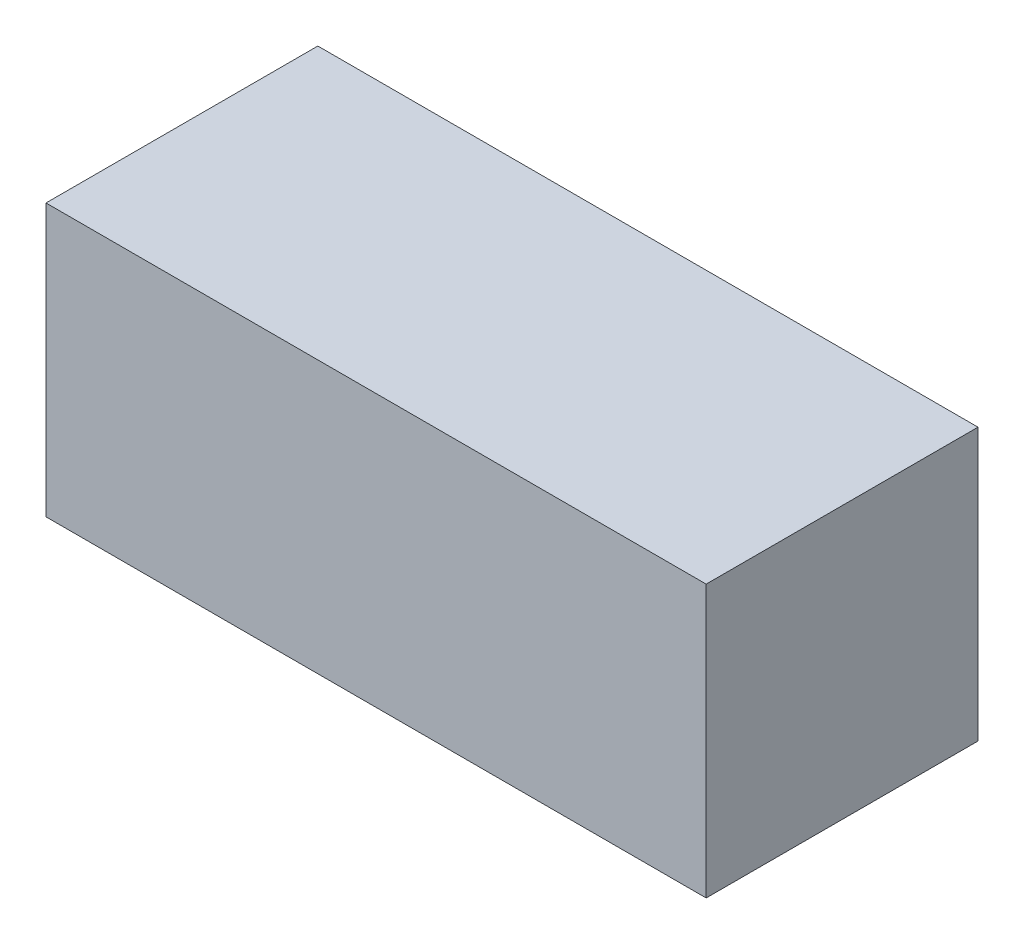
ISO-10303-21;
HEADER;
FILE_DESCRIPTION(('STEP AP214'),'2;1');
FILE_NAME('part.step','',(''),(''),'','','');
FILE_SCHEMA(('AUTOMOTIVE_DESIGN { 1 0 10303 214 1 1 1 1 }'));
ENDSEC;
DATA;
#1=APPLICATION_CONTEXT('core data for automotive mechanical design processes');
#2=APPLICATION_PROTOCOL_DEFINITION('international standard','automotive_design',2000,#1);
#3=PRODUCT_CONTEXT('',#1,'mechanical');
#4=PRODUCT('Part','Part','',(#3));
#5=PRODUCT_RELATED_PRODUCT_CATEGORY('part','',(#4));
#6=PRODUCT_DEFINITION_FORMATION('','',#4);
#7=PRODUCT_DEFINITION_CONTEXT('part definition',#1,'design');
#8=PRODUCT_DEFINITION('design','',#6,#7);
#9=PRODUCT_DEFINITION_SHAPE('','',#8);
#10=(LENGTH_UNIT() NAMED_UNIT(*) SI_UNIT(.MILLI.,.METRE.));
#11=(NAMED_UNIT(*) PLANE_ANGLE_UNIT() SI_UNIT($,.RADIAN.));
#12=(NAMED_UNIT(*) SI_UNIT($,.STERADIAN.) SOLID_ANGLE_UNIT());
#13=UNCERTAINTY_MEASURE_WITH_UNIT(LENGTH_MEASURE(1.E-05),#10,'distance_accuracy_value','');
#14=(GEOMETRIC_REPRESENTATION_CONTEXT(3) GLOBAL_UNCERTAINTY_ASSIGNED_CONTEXT((#13)) GLOBAL_UNIT_ASSIGNED_CONTEXT((#10,
#11,#12)) REPRESENTATION_CONTEXT('',''));
#15=CARTESIAN_POINT('',(0.,0.,0.));
#16=DIRECTION('',(0.,0.,1.));
#17=DIRECTION('',(1.,0.,0.));
#18=AXIS2_PLACEMENT_3D('',#15,#16,#17);
#19=CARTESIAN_POINT('',(85.,-35.,35.));
#20=DIRECTION('',(-1.,0.,0.));
#21=DIRECTION('',(0.,0.,1.));
#22=AXIS2_PLACEMENT_3D('',#19,#20,#21);
#23=PLANE('',#22);
#24=DIRECTION('',(0.,1.,0.));
#25=VECTOR('',#24,1.);
#26=CARTESIAN_POINT('',(85.,-35.,-35.));
#27=LINE('',#26,#25);
#28=CARTESIAN_POINT('',(85.,-35.,-35.));
#29=VERTEX_POINT('',#28);
#30=CARTESIAN_POINT('',(85.,35.,-35.));
#31=VERTEX_POINT('',#30);
#32=EDGE_CURVE('E99',#29,#31,#27,.T.);
#33=ORIENTED_EDGE('',*,*,#32,.T.);
#34=DIRECTION('',(0.,0.,-1.));
#35=VECTOR('',#34,1.);
#36=CARTESIAN_POINT('',(85.,35.,35.));
#37=LINE('',#36,#35);
#38=CARTESIAN_POINT('',(85.,35.,35.));
#39=VERTEX_POINT('',#38);
#40=EDGE_CURVE('E11',#39,#31,#37,.T.);
#41=ORIENTED_EDGE('',*,*,#40,.F.);
#42=DIRECTION('',(0.,1.,0.));
#43=VECTOR('',#42,1.);
#44=CARTESIAN_POINT('',(85.,-35.,35.));
#45=LINE('',#44,#43);
#46=CARTESIAN_POINT('',(85.,-35.,35.));
#47=VERTEX_POINT('',#46);
#48=EDGE_CURVE('E87',#47,#39,#45,.T.);
#49=ORIENTED_EDGE('',*,*,#48,.F.);
#50=DIRECTION('',(0.,0.,-1.));
#51=VECTOR('',#50,1.);
#52=CARTESIAN_POINT('',(85.,-35.,35.));
#53=LINE('',#52,#51);
#54=EDGE_CURVE('E95',#47,#29,#53,.T.);
#55=ORIENTED_EDGE('',*,*,#54,.T.);
#56=EDGE_LOOP('',(#33,#41,#49,#55));
#57=FACE_BOUND('',#56,.T.);
#58=ADVANCED_FACE('F36',(#57),#23,.F.);
#59=CARTESIAN_POINT('',(-85.,35.,35.));
#60=DIRECTION('',(0.,-1.,0.));
#61=DIRECTION('',(0.,0.,-1.));
#62=AXIS2_PLACEMENT_3D('',#59,#60,#61);
#63=PLANE('',#62);
#64=DIRECTION('',(-1.,0.,0.));
#65=VECTOR('',#64,1.);
#66=CARTESIAN_POINT('',(-85.,35.,-35.));
#67=LINE('',#66,#65);
#68=CARTESIAN_POINT('',(-85.,35.,-35.));
#69=VERTEX_POINT('',#68);
#70=EDGE_CURVE('E91',#31,#69,#67,.T.);
#71=ORIENTED_EDGE('',*,*,#70,.T.);
#72=DIRECTION('',(0.,0.,-1.));
#73=VECTOR('',#72,1.);
#74=CARTESIAN_POINT('',(-85.,35.,35.));
#75=LINE('',#74,#73);
#76=CARTESIAN_POINT('',(-85.,35.,35.));
#77=VERTEX_POINT('',#76);
#78=EDGE_CURVE('E44',#77,#69,#75,.T.);
#79=ORIENTED_EDGE('',*,*,#78,.F.);
#80=DIRECTION('',(-1.,0.,0.));
#81=VECTOR('',#80,1.);
#82=CARTESIAN_POINT('',(-85.,35.,35.));
#83=LINE('',#82,#81);
#84=EDGE_CURVE('E82',#39,#77,#83,.T.);
#85=ORIENTED_EDGE('',*,*,#84,.F.);
#86=ORIENTED_EDGE('',*,*,#40,.T.);
#87=EDGE_LOOP('',(#71,#79,#85,#86));
#88=FACE_BOUND('',#87,.T.);
#89=ADVANCED_FACE('F90',(#88),#63,.F.);
#90=CARTESIAN_POINT('',(-85.,-35.,35.));
#91=DIRECTION('',(1.,0.,0.));
#92=DIRECTION('',(0.,0.,-1.));
#93=AXIS2_PLACEMENT_3D('',#90,#91,#92);
#94=PLANE('',#93);
#95=DIRECTION('',(0.,-1.,0.));
#96=VECTOR('',#95,1.);
#97=CARTESIAN_POINT('',(-85.,-35.,-35.));
#98=LINE('',#97,#96);
#99=CARTESIAN_POINT('',(-85.,-35.,-35.));
#100=VERTEX_POINT('',#99);
#101=EDGE_CURVE('E69',#69,#100,#98,.T.);
#102=ORIENTED_EDGE('',*,*,#101,.T.);
#103=DIRECTION('',(0.,0.,-1.));
#104=VECTOR('',#103,1.);
#105=CARTESIAN_POINT('',(-85.,-35.,35.));
#106=LINE('',#105,#104);
#107=CARTESIAN_POINT('',(-85.,-35.,35.));
#108=VERTEX_POINT('',#107);
#109=EDGE_CURVE('E92',#108,#100,#106,.T.);
#110=ORIENTED_EDGE('',*,*,#109,.F.);
#111=DIRECTION('',(0.,-1.,0.));
#112=VECTOR('',#111,1.);
#113=CARTESIAN_POINT('',(-85.,-35.,35.));
#114=LINE('',#113,#112);
#115=EDGE_CURVE('E85',#77,#108,#114,.T.);
#116=ORIENTED_EDGE('',*,*,#115,.F.);
#117=ORIENTED_EDGE('',*,*,#78,.T.);
#118=EDGE_LOOP('',(#102,#110,#116,#117));
#119=FACE_BOUND('',#118,.T.);
#120=ADVANCED_FACE('F93',(#119),#94,.F.);
#121=CARTESIAN_POINT('',(-85.,-35.,35.));
#122=DIRECTION('',(0.,1.,0.));
#123=DIRECTION('',(0.,0.,1.));
#124=AXIS2_PLACEMENT_3D('',#121,#122,#123);
#125=PLANE('',#124);
#126=DIRECTION('',(1.,0.,0.));
#127=VECTOR('',#126,1.);
#128=CARTESIAN_POINT('',(-85.,-35.,-35.));
#129=LINE('',#128,#127);
#130=EDGE_CURVE('E75',#100,#29,#129,.T.);
#131=ORIENTED_EDGE('',*,*,#130,.T.);
#132=ORIENTED_EDGE('',*,*,#54,.F.);
#133=DIRECTION('',(1.,0.,0.));
#134=VECTOR('',#133,1.);
#135=CARTESIAN_POINT('',(-85.,-35.,35.));
#136=LINE('',#135,#134);
#137=EDGE_CURVE('E52',#108,#47,#136,.T.);
#138=ORIENTED_EDGE('',*,*,#137,.F.);
#139=ORIENTED_EDGE('',*,*,#109,.T.);
#140=EDGE_LOOP('',(#131,#132,#138,#139));
#141=FACE_BOUND('',#140,.T.);
#142=ADVANCED_FACE('F106',(#141),#125,.F.);
#143=CARTESIAN_POINT('',(0.,0.,35.));
#144=DIRECTION('',(0.,0.,-1.));
#145=DIRECTION('',(-1.,0.,0.));
#146=AXIS2_PLACEMENT_3D('',#143,#144,#145);
#147=PLANE('',#146);
#148=ORIENTED_EDGE('',*,*,#48,.T.);
#149=ORIENTED_EDGE('',*,*,#84,.T.);
#150=ORIENTED_EDGE('',*,*,#115,.T.);
#151=ORIENTED_EDGE('',*,*,#137,.T.);
#152=EDGE_LOOP('',(#148,#149,#150,#151));
#153=FACE_BOUND('',#152,.T.);
#154=ADVANCED_FACE('F83',(#153),#147,.F.);
#155=CARTESIAN_POINT('',(0.,0.,-35.));
#156=DIRECTION('',(0.,0.,-1.));
#157=DIRECTION('',(-1.,0.,0.));
#158=AXIS2_PLACEMENT_3D('',#155,#156,#157);
#159=PLANE('',#158);
#160=ORIENTED_EDGE('',*,*,#32,.F.);
#161=ORIENTED_EDGE('',*,*,#130,.F.);
#162=ORIENTED_EDGE('',*,*,#101,.F.);
#163=ORIENTED_EDGE('',*,*,#70,.F.);
#164=EDGE_LOOP('',(#160,#161,#162,#163));
#165=FACE_BOUND('',#164,.T.);
#166=ADVANCED_FACE('F109',(#165),#159,.T.);
#167=CLOSED_SHELL('',(#58,#89,#120,#142,#154,#166));
#168=MANIFOLD_SOLID_BREP('B2',#167);
#169=ADVANCED_BREP_SHAPE_REPRESENTATION('',(#18,#168),#14);
#170=SHAPE_DEFINITION_REPRESENTATION(#9,#169);
ENDSEC;
END-ISO-10303-21;
